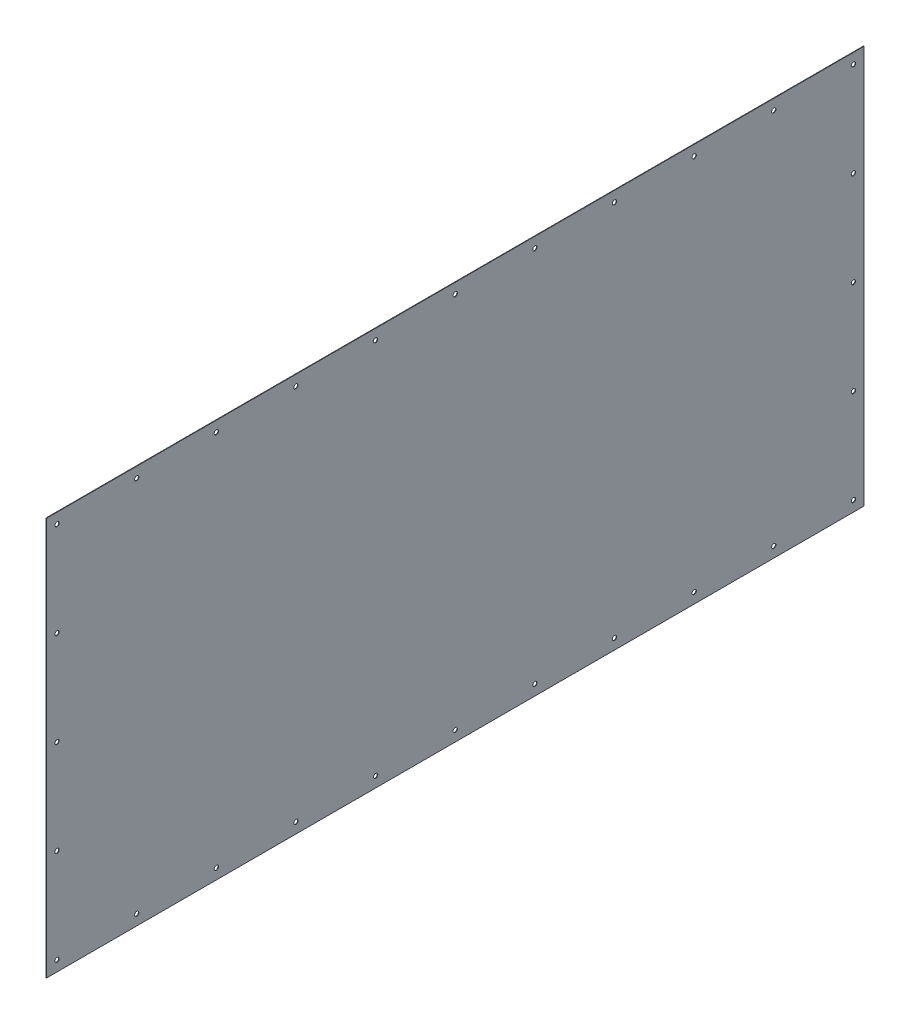
ISO-10303-21;
HEADER;
FILE_DESCRIPTION(('STEP AP214'),'2;1');
FILE_NAME('part.step','',(''),(''),'','','');
FILE_SCHEMA(('AUTOMOTIVE_DESIGN { 1 0 10303 214 1 1 1 1 }'));
ENDSEC;
DATA;
#1=APPLICATION_CONTEXT('core data for automotive mechanical design processes');
#2=APPLICATION_PROTOCOL_DEFINITION('international standard','automotive_design',2000,#1);
#3=PRODUCT_CONTEXT('',#1,'mechanical');
#4=PRODUCT('Part','Part','',(#3));
#5=PRODUCT_RELATED_PRODUCT_CATEGORY('part','',(#4));
#6=PRODUCT_DEFINITION_FORMATION('','',#4);
#7=PRODUCT_DEFINITION_CONTEXT('part definition',#1,'design');
#8=PRODUCT_DEFINITION('design','',#6,#7);
#9=PRODUCT_DEFINITION_SHAPE('','',#8);
#10=(LENGTH_UNIT() NAMED_UNIT(*) SI_UNIT(.MILLI.,.METRE.));
#11=(NAMED_UNIT(*) PLANE_ANGLE_UNIT() SI_UNIT($,.RADIAN.));
#12=(NAMED_UNIT(*) SI_UNIT($,.STERADIAN.) SOLID_ANGLE_UNIT());
#13=UNCERTAINTY_MEASURE_WITH_UNIT(LENGTH_MEASURE(1.E-05),#10,'distance_accuracy_value','');
#14=(GEOMETRIC_REPRESENTATION_CONTEXT(3) GLOBAL_UNCERTAINTY_ASSIGNED_CONTEXT((#13)) GLOBAL_UNIT_ASSIGNED_CONTEXT((#10,
#11,#12)) REPRESENTATION_CONTEXT('',''));
#15=CARTESIAN_POINT('',(0.,0.,0.));
#16=DIRECTION('',(0.,0.,1.));
#17=DIRECTION('',(1.,0.,0.));
#18=AXIS2_PLACEMENT_3D('',#15,#16,#17);
#19=CARTESIAN_POINT('',(1.,0.,0.));
#20=DIRECTION('',(1.,0.,0.));
#21=DIRECTION('',(0.,0.,-1.));
#22=AXIS2_PLACEMENT_3D('',#19,#20,#21);
#23=PLANE('',#22);
#24=CARTESIAN_POINT('',(1.,179.990000138896,-759.96));
#25=DIRECTION('',(1.,0.,0.));
#26=DIRECTION('',(0.,0.,-1.));
#27=AXIS2_PLACEMENT_3D('',#24,#25,#26);
#28=CIRCLE('',#27,4.10000000000004);
#29=CARTESIAN_POINT('',(1.,179.990000138896,-764.06));
#30=VERTEX_POINT('',#29);
#31=EDGE_CURVE('E265',#30,#30,#28,.T.);
#32=ORIENTED_EDGE('',*,*,#31,.F.);
#33=EDGE_LOOP('',(#32));
#34=FACE_BOUND('',#33,.T.);
#35=CARTESIAN_POINT('',(1.,-179.990000138897,759.96));
#36=DIRECTION('',(1.,0.,0.));
#37=DIRECTION('',(0.,0.,-1.));
#38=AXIS2_PLACEMENT_3D('',#35,#36,#37);
#39=CIRCLE('',#38,4.10000000000004);
#40=CARTESIAN_POINT('',(1.,-179.990000138897,755.86));
#41=VERTEX_POINT('',#40);
#42=EDGE_CURVE('E253',#41,#41,#39,.T.);
#43=ORIENTED_EDGE('',*,*,#42,.F.);
#44=EDGE_LOOP('',(#43));
#45=FACE_BOUND('',#44,.T.);
#46=CARTESIAN_POINT('',(1.,359.98,-759.94));
#47=DIRECTION('',(1.,0.,0.));
#48=DIRECTION('',(0.,0.,-1.));
#49=AXIS2_PLACEMENT_3D('',#46,#47,#48);
#50=CIRCLE('',#49,4.10000000000004);
#51=CARTESIAN_POINT('',(1.,359.98,-764.04));
#52=VERTEX_POINT('',#51);
#53=EDGE_CURVE('E241',#52,#52,#50,.T.);
#54=ORIENTED_EDGE('',*,*,#53,.F.);
#55=EDGE_LOOP('',(#54));
#56=FACE_BOUND('',#55,.T.);
#57=CARTESIAN_POINT('',(1.,359.98,-607.95));
#58=DIRECTION('',(1.,0.,0.));
#59=DIRECTION('',(0.,0.,-1.));
#60=AXIS2_PLACEMENT_3D('',#57,#58,#59);
#61=CIRCLE('',#60,4.10000000000004);
#62=CARTESIAN_POINT('',(1.,359.98,-612.05));
#63=VERTEX_POINT('',#62);
#64=EDGE_CURVE('E229',#63,#63,#61,.T.);
#65=ORIENTED_EDGE('',*,*,#64,.F.);
#66=EDGE_LOOP('',(#65));
#67=FACE_BOUND('',#66,.T.);
#68=CARTESIAN_POINT('',(1.,359.98,-455.96));
#69=DIRECTION('',(1.,0.,0.));
#70=DIRECTION('',(0.,0.,-1.));
#71=AXIS2_PLACEMENT_3D('',#68,#69,#70);
#72=CIRCLE('',#71,4.10000000000004);
#73=CARTESIAN_POINT('',(1.,359.98,-460.06));
#74=VERTEX_POINT('',#73);
#75=EDGE_CURVE('E217',#74,#74,#72,.T.);
#76=ORIENTED_EDGE('',*,*,#75,.F.);
#77=EDGE_LOOP('',(#76));
#78=FACE_BOUND('',#77,.T.);
#79=CARTESIAN_POINT('',(1.,359.98,-303.97));
#80=DIRECTION('',(1.,0.,0.));
#81=DIRECTION('',(0.,0.,-1.));
#82=AXIS2_PLACEMENT_3D('',#79,#80,#81);
#83=CIRCLE('',#82,4.10000000000004);
#84=CARTESIAN_POINT('',(1.,359.98,-308.07));
#85=VERTEX_POINT('',#84);
#86=EDGE_CURVE('E205',#85,#85,#83,.T.);
#87=ORIENTED_EDGE('',*,*,#86,.F.);
#88=EDGE_LOOP('',(#87));
#89=FACE_BOUND('',#88,.T.);
#90=CARTESIAN_POINT('',(1.,359.98,-151.98));
#91=DIRECTION('',(1.,0.,0.));
#92=DIRECTION('',(0.,0.,-1.));
#93=AXIS2_PLACEMENT_3D('',#90,#91,#92);
#94=CIRCLE('',#93,4.10000000000004);
#95=CARTESIAN_POINT('',(1.,359.98,-156.08));
#96=VERTEX_POINT('',#95);
#97=EDGE_CURVE('E193',#96,#96,#94,.T.);
#98=ORIENTED_EDGE('',*,*,#97,.F.);
#99=EDGE_LOOP('',(#98));
#100=FACE_BOUND('',#99,.T.);
#101=CARTESIAN_POINT('',(1.,359.98,0.00999999999973245));
#102=DIRECTION('',(1.,0.,0.));
#103=DIRECTION('',(0.,0.,-1.));
#104=AXIS2_PLACEMENT_3D('',#101,#102,#103);
#105=CIRCLE('',#104,4.10000000000004);
#106=CARTESIAN_POINT('',(1.,359.98,-4.09000000000031));
#107=VERTEX_POINT('',#106);
#108=EDGE_CURVE('E181',#107,#107,#105,.T.);
#109=ORIENTED_EDGE('',*,*,#108,.F.);
#110=EDGE_LOOP('',(#109));
#111=FACE_BOUND('',#110,.T.);
#112=CARTESIAN_POINT('',(1.,359.98,152.));
#113=DIRECTION('',(1.,0.,0.));
#114=DIRECTION('',(0.,0.,-1.));
#115=AXIS2_PLACEMENT_3D('',#112,#113,#114);
#116=CIRCLE('',#115,4.10000000000004);
#117=CARTESIAN_POINT('',(1.,359.98,147.9));
#118=VERTEX_POINT('',#117);
#119=EDGE_CURVE('E169',#118,#118,#116,.T.);
#120=ORIENTED_EDGE('',*,*,#119,.F.);
#121=EDGE_LOOP('',(#120));
#122=FACE_BOUND('',#121,.T.);
#123=CARTESIAN_POINT('',(1.,359.98,303.99));
#124=DIRECTION('',(1.,0.,0.));
#125=DIRECTION('',(0.,0.,-1.));
#126=AXIS2_PLACEMENT_3D('',#123,#124,#125);
#127=CIRCLE('',#126,4.10000000000004);
#128=CARTESIAN_POINT('',(1.,359.98,299.89));
#129=VERTEX_POINT('',#128);
#130=EDGE_CURVE('E157',#129,#129,#127,.T.);
#131=ORIENTED_EDGE('',*,*,#130,.F.);
#132=EDGE_LOOP('',(#131));
#133=FACE_BOUND('',#132,.T.);
#134=CARTESIAN_POINT('',(1.,359.98,455.98));
#135=DIRECTION('',(1.,0.,0.));
#136=DIRECTION('',(0.,0.,-1.));
#137=AXIS2_PLACEMENT_3D('',#134,#135,#136);
#138=CIRCLE('',#137,4.10000000000004);
#139=CARTESIAN_POINT('',(1.,359.98,451.88));
#140=VERTEX_POINT('',#139);
#141=EDGE_CURVE('E145',#140,#140,#138,.T.);
#142=ORIENTED_EDGE('',*,*,#141,.F.);
#143=EDGE_LOOP('',(#142));
#144=FACE_BOUND('',#143,.T.);
#145=CARTESIAN_POINT('',(1.,359.98,607.97));
#146=DIRECTION('',(1.,0.,0.));
#147=DIRECTION('',(0.,0.,-1.));
#148=AXIS2_PLACEMENT_3D('',#145,#146,#147);
#149=CIRCLE('',#148,4.10000000000004);
#150=CARTESIAN_POINT('',(1.,359.98,603.87));
#151=VERTEX_POINT('',#150);
#152=EDGE_CURVE('E133',#151,#151,#149,.T.);
#153=ORIENTED_EDGE('',*,*,#152,.F.);
#154=EDGE_LOOP('',(#153));
#155=FACE_BOUND('',#154,.T.);
#156=CARTESIAN_POINT('',(1.,179.990000138896,759.96));
#157=DIRECTION('',(1.,0.,0.));
#158=DIRECTION('',(0.,0.,-1.));
#159=AXIS2_PLACEMENT_3D('',#156,#157,#158);
#160=CIRCLE('',#159,4.10000000000004);
#161=CARTESIAN_POINT('',(1.,179.990000138896,755.86));
#162=VERTEX_POINT('',#161);
#163=EDGE_CURVE('E121',#162,#162,#160,.T.);
#164=ORIENTED_EDGE('',*,*,#163,.F.);
#165=EDGE_LOOP('',(#164));
#166=FACE_BOUND('',#165,.T.);
#167=CARTESIAN_POINT('',(1.,-359.98,759.96));
#168=DIRECTION('',(1.,0.,0.));
#169=DIRECTION('',(0.,0.,-1.));
#170=AXIS2_PLACEMENT_3D('',#167,#168,#169);
#171=CIRCLE('',#170,4.10000000000004);
#172=CARTESIAN_POINT('',(1.,-359.98,755.86));
#173=VERTEX_POINT('',#172);
#174=EDGE_CURVE('E100',#173,#173,#171,.T.);
#175=ORIENTED_EDGE('',*,*,#174,.F.);
#176=EDGE_LOOP('',(#175));
#177=FACE_BOUND('',#176,.T.);
#178=DIRECTION('',(0.,1.,0.));
#179=VECTOR('',#178,1.);
#180=CARTESIAN_POINT('',(1.,379.98,-779.96));
#181=LINE('',#180,#179);
#182=CARTESIAN_POINT('',(1.,-379.98,-779.96));
#183=VERTEX_POINT('',#182);
#184=CARTESIAN_POINT('',(1.,379.98,-779.96));
#185=VERTEX_POINT('',#184);
#186=EDGE_CURVE('E85',#183,#185,#181,.T.);
#187=ORIENTED_EDGE('',*,*,#186,.T.);
#188=DIRECTION('',(0.,0.,1.));
#189=VECTOR('',#188,1.);
#190=CARTESIAN_POINT('',(1.,379.98,779.96));
#191=LINE('',#190,#189);
#192=CARTESIAN_POINT('',(1.,379.98,779.96));
#193=VERTEX_POINT('',#192);
#194=EDGE_CURVE('E80',#185,#193,#191,.T.);
#195=ORIENTED_EDGE('',*,*,#194,.T.);
#196=DIRECTION('',(0.,-1.,0.));
#197=VECTOR('',#196,1.);
#198=CARTESIAN_POINT('',(1.,379.98,779.96));
#199=LINE('',#198,#197);
#200=CARTESIAN_POINT('',(1.,-379.98,779.96));
#201=VERTEX_POINT('',#200);
#202=EDGE_CURVE('E83',#193,#201,#199,.T.);
#203=ORIENTED_EDGE('',*,*,#202,.T.);
#204=DIRECTION('',(0.,0.,-1.));
#205=VECTOR('',#204,1.);
#206=CARTESIAN_POINT('',(1.,-379.98,779.96));
#207=LINE('',#206,#205);
#208=EDGE_CURVE('E50',#201,#183,#207,.T.);
#209=ORIENTED_EDGE('',*,*,#208,.T.);
#210=EDGE_LOOP('',(#187,#195,#203,#209));
#211=FACE_BOUND('',#210,.T.);
#212=CARTESIAN_POINT('',(1.,359.98,759.96));
#213=DIRECTION('',(1.,0.,0.));
#214=DIRECTION('',(0.,0.,-1.));
#215=AXIS2_PLACEMENT_3D('',#212,#213,#214);
#216=CIRCLE('',#215,4.10000000000004);
#217=CARTESIAN_POINT('',(1.,359.98,755.86));
#218=VERTEX_POINT('',#217);
#219=EDGE_CURVE('E115',#218,#218,#216,.T.);
#220=ORIENTED_EDGE('',*,*,#219,.F.);
#221=EDGE_LOOP('',(#220));
#222=FACE_BOUND('',#221,.T.);
#223=CARTESIAN_POINT('',(1.,-359.98,607.97));
#224=DIRECTION('',(1.,0.,0.));
#225=DIRECTION('',(0.,0.,-1.));
#226=AXIS2_PLACEMENT_3D('',#223,#224,#225);
#227=CIRCLE('',#226,4.10000000000004);
#228=CARTESIAN_POINT('',(1.,-359.98,603.87));
#229=VERTEX_POINT('',#228);
#230=EDGE_CURVE('E127',#229,#229,#227,.T.);
#231=ORIENTED_EDGE('',*,*,#230,.F.);
#232=EDGE_LOOP('',(#231));
#233=FACE_BOUND('',#232,.T.);
#234=CARTESIAN_POINT('',(1.,-359.98,455.98));
#235=DIRECTION('',(1.,0.,0.));
#236=DIRECTION('',(0.,0.,-1.));
#237=AXIS2_PLACEMENT_3D('',#234,#235,#236);
#238=CIRCLE('',#237,4.10000000000004);
#239=CARTESIAN_POINT('',(1.,-359.98,451.88));
#240=VERTEX_POINT('',#239);
#241=EDGE_CURVE('E139',#240,#240,#238,.T.);
#242=ORIENTED_EDGE('',*,*,#241,.F.);
#243=EDGE_LOOP('',(#242));
#244=FACE_BOUND('',#243,.T.);
#245=CARTESIAN_POINT('',(1.,-359.98,303.99));
#246=DIRECTION('',(1.,0.,0.));
#247=DIRECTION('',(0.,0.,-1.));
#248=AXIS2_PLACEMENT_3D('',#245,#246,#247);
#249=CIRCLE('',#248,4.10000000000004);
#250=CARTESIAN_POINT('',(1.,-359.98,299.89));
#251=VERTEX_POINT('',#250);
#252=EDGE_CURVE('E151',#251,#251,#249,.T.);
#253=ORIENTED_EDGE('',*,*,#252,.F.);
#254=EDGE_LOOP('',(#253));
#255=FACE_BOUND('',#254,.T.);
#256=CARTESIAN_POINT('',(1.,-359.98,152.));
#257=DIRECTION('',(1.,0.,0.));
#258=DIRECTION('',(0.,0.,-1.));
#259=AXIS2_PLACEMENT_3D('',#256,#257,#258);
#260=CIRCLE('',#259,4.10000000000004);
#261=CARTESIAN_POINT('',(1.,-359.98,147.9));
#262=VERTEX_POINT('',#261);
#263=EDGE_CURVE('E163',#262,#262,#260,.T.);
#264=ORIENTED_EDGE('',*,*,#263,.F.);
#265=EDGE_LOOP('',(#264));
#266=FACE_BOUND('',#265,.T.);
#267=CARTESIAN_POINT('',(1.,-359.98,0.00999999999973245));
#268=DIRECTION('',(1.,0.,0.));
#269=DIRECTION('',(0.,0.,-1.));
#270=AXIS2_PLACEMENT_3D('',#267,#268,#269);
#271=CIRCLE('',#270,4.10000000000004);
#272=CARTESIAN_POINT('',(1.,-359.98,-4.09000000000031));
#273=VERTEX_POINT('',#272);
#274=EDGE_CURVE('E175',#273,#273,#271,.T.);
#275=ORIENTED_EDGE('',*,*,#274,.F.);
#276=EDGE_LOOP('',(#275));
#277=FACE_BOUND('',#276,.T.);
#278=CARTESIAN_POINT('',(1.,-359.98,-151.98));
#279=DIRECTION('',(1.,0.,0.));
#280=DIRECTION('',(0.,0.,-1.));
#281=AXIS2_PLACEMENT_3D('',#278,#279,#280);
#282=CIRCLE('',#281,4.10000000000004);
#283=CARTESIAN_POINT('',(1.,-359.98,-156.08));
#284=VERTEX_POINT('',#283);
#285=EDGE_CURVE('E187',#284,#284,#282,.T.);
#286=ORIENTED_EDGE('',*,*,#285,.F.);
#287=EDGE_LOOP('',(#286));
#288=FACE_BOUND('',#287,.T.);
#289=CARTESIAN_POINT('',(1.,-359.98,-303.97));
#290=DIRECTION('',(1.,0.,0.));
#291=DIRECTION('',(0.,0.,-1.));
#292=AXIS2_PLACEMENT_3D('',#289,#290,#291);
#293=CIRCLE('',#292,4.10000000000004);
#294=CARTESIAN_POINT('',(1.,-359.98,-308.07));
#295=VERTEX_POINT('',#294);
#296=EDGE_CURVE('E199',#295,#295,#293,.T.);
#297=ORIENTED_EDGE('',*,*,#296,.F.);
#298=EDGE_LOOP('',(#297));
#299=FACE_BOUND('',#298,.T.);
#300=CARTESIAN_POINT('',(1.,-359.98,-455.96));
#301=DIRECTION('',(1.,0.,0.));
#302=DIRECTION('',(0.,0.,-1.));
#303=AXIS2_PLACEMENT_3D('',#300,#301,#302);
#304=CIRCLE('',#303,4.10000000000004);
#305=CARTESIAN_POINT('',(1.,-359.98,-460.06));
#306=VERTEX_POINT('',#305);
#307=EDGE_CURVE('E211',#306,#306,#304,.T.);
#308=ORIENTED_EDGE('',*,*,#307,.F.);
#309=EDGE_LOOP('',(#308));
#310=FACE_BOUND('',#309,.T.);
#311=CARTESIAN_POINT('',(1.,-359.98,-607.95));
#312=DIRECTION('',(1.,0.,0.));
#313=DIRECTION('',(0.,0.,-1.));
#314=AXIS2_PLACEMENT_3D('',#311,#312,#313);
#315=CIRCLE('',#314,4.10000000000004);
#316=CARTESIAN_POINT('',(1.,-359.98,-612.05));
#317=VERTEX_POINT('',#316);
#318=EDGE_CURVE('E223',#317,#317,#315,.T.);
#319=ORIENTED_EDGE('',*,*,#318,.F.);
#320=EDGE_LOOP('',(#319));
#321=FACE_BOUND('',#320,.T.);
#322=CARTESIAN_POINT('',(1.,-359.98,-759.94));
#323=DIRECTION('',(1.,0.,0.));
#324=DIRECTION('',(0.,0.,-1.));
#325=AXIS2_PLACEMENT_3D('',#322,#323,#324);
#326=CIRCLE('',#325,4.10000000000004);
#327=CARTESIAN_POINT('',(1.,-359.98,-764.04));
#328=VERTEX_POINT('',#327);
#329=EDGE_CURVE('E235',#328,#328,#326,.T.);
#330=ORIENTED_EDGE('',*,*,#329,.F.);
#331=EDGE_LOOP('',(#330));
#332=FACE_BOUND('',#331,.T.);
#333=CARTESIAN_POINT('',(1.,1.11022302462516E-13,759.96));
#334=DIRECTION('',(1.,0.,0.));
#335=DIRECTION('',(0.,0.,-1.));
#336=AXIS2_PLACEMENT_3D('',#333,#334,#335);
#337=CIRCLE('',#336,4.10000000000004);
#338=CARTESIAN_POINT('',(1.,1.11022302462516E-13,755.86));
#339=VERTEX_POINT('',#338);
#340=EDGE_CURVE('E247',#339,#339,#337,.T.);
#341=ORIENTED_EDGE('',*,*,#340,.F.);
#342=EDGE_LOOP('',(#341));
#343=FACE_BOUND('',#342,.T.);
#344=CARTESIAN_POINT('',(1.,1.11022302462516E-13,-759.96));
#345=DIRECTION('',(1.,0.,0.));
#346=DIRECTION('',(0.,0.,-1.));
#347=AXIS2_PLACEMENT_3D('',#344,#345,#346);
#348=CIRCLE('',#347,4.10000000000004);
#349=CARTESIAN_POINT('',(1.,1.11022302462516E-13,-764.06));
#350=VERTEX_POINT('',#349);
#351=EDGE_CURVE('E259',#350,#350,#348,.T.);
#352=ORIENTED_EDGE('',*,*,#351,.F.);
#353=EDGE_LOOP('',(#352));
#354=FACE_BOUND('',#353,.T.);
#355=CARTESIAN_POINT('',(1.,-179.990000138897,-759.96));
#356=DIRECTION('',(1.,0.,0.));
#357=DIRECTION('',(0.,0.,-1.));
#358=AXIS2_PLACEMENT_3D('',#355,#356,#357);
#359=CIRCLE('',#358,4.10000000000004);
#360=CARTESIAN_POINT('',(1.,-179.990000138897,-764.06));
#361=VERTEX_POINT('',#360);
#362=EDGE_CURVE('E271',#361,#361,#359,.T.);
#363=ORIENTED_EDGE('',*,*,#362,.F.);
#364=EDGE_LOOP('',(#363));
#365=FACE_BOUND('',#364,.T.);
#366=ADVANCED_FACE('F33',(#34,#45,#56,#67,#78,#89,#100,#111,#122,#133,#144,#155,#166,#177,#211,
#222,#233,#244,#255,#266,#277,#288,#299,#310,#321,#332,#343,#354,#365),#23,.T.);
#367=CARTESIAN_POINT('',(0.,0.,0.));
#368=DIRECTION('',(1.,0.,0.));
#369=DIRECTION('',(0.,0.,-1.));
#370=AXIS2_PLACEMENT_3D('',#367,#368,#369);
#371=PLANE('',#370);
#372=DIRECTION('',(0.,1.,0.));
#373=VECTOR('',#372,1.);
#374=CARTESIAN_POINT('',(0.,379.98,-779.96));
#375=LINE('',#374,#373);
#376=CARTESIAN_POINT('',(0.,-379.98,-779.96));
#377=VERTEX_POINT('',#376);
#378=CARTESIAN_POINT('',(0.,379.98,-779.96));
#379=VERTEX_POINT('',#378);
#380=EDGE_CURVE('E97',#377,#379,#375,.T.);
#381=ORIENTED_EDGE('',*,*,#380,.F.);
#382=DIRECTION('',(0.,0.,-1.));
#383=VECTOR('',#382,1.);
#384=CARTESIAN_POINT('',(0.,-379.98,779.96));
#385=LINE('',#384,#383);
#386=CARTESIAN_POINT('',(0.,-379.98,779.96));
#387=VERTEX_POINT('',#386);
#388=EDGE_CURVE('E73',#387,#377,#385,.T.);
#389=ORIENTED_EDGE('',*,*,#388,.F.);
#390=DIRECTION('',(0.,-1.,0.));
#391=VECTOR('',#390,1.);
#392=CARTESIAN_POINT('',(0.,379.98,779.96));
#393=LINE('',#392,#391);
#394=CARTESIAN_POINT('',(0.,379.98,779.96));
#395=VERTEX_POINT('',#394);
#396=EDGE_CURVE('E67',#395,#387,#393,.T.);
#397=ORIENTED_EDGE('',*,*,#396,.F.);
#398=DIRECTION('',(0.,0.,1.));
#399=VECTOR('',#398,1.);
#400=CARTESIAN_POINT('',(0.,379.98,779.96));
#401=LINE('',#400,#399);
#402=EDGE_CURVE('E89',#379,#395,#401,.T.);
#403=ORIENTED_EDGE('',*,*,#402,.F.);
#404=EDGE_LOOP('',(#381,#389,#397,#403));
#405=FACE_BOUND('',#404,.T.);
#406=CARTESIAN_POINT('',(0.,-359.98,759.96));
#407=DIRECTION('',(1.,0.,0.));
#408=DIRECTION('',(0.,0.,-1.));
#409=AXIS2_PLACEMENT_3D('',#406,#407,#408);
#410=CIRCLE('',#409,4.10000000000004);
#411=CARTESIAN_POINT('',(0.,-359.98,755.86));
#412=VERTEX_POINT('',#411);
#413=EDGE_CURVE('E112',#412,#412,#410,.T.);
#414=ORIENTED_EDGE('',*,*,#413,.T.);
#415=EDGE_LOOP('',(#414));
#416=FACE_BOUND('',#415,.T.);
#417=CARTESIAN_POINT('',(0.,359.98,759.96));
#418=DIRECTION('',(1.,0.,0.));
#419=DIRECTION('',(0.,0.,-1.));
#420=AXIS2_PLACEMENT_3D('',#417,#418,#419);
#421=CIRCLE('',#420,4.10000000000004);
#422=CARTESIAN_POINT('',(0.,359.98,755.86));
#423=VERTEX_POINT('',#422);
#424=EDGE_CURVE('E118',#423,#423,#421,.T.);
#425=ORIENTED_EDGE('',*,*,#424,.T.);
#426=EDGE_LOOP('',(#425));
#427=FACE_BOUND('',#426,.T.);
#428=CARTESIAN_POINT('',(0.,179.990000138896,759.96));
#429=DIRECTION('',(1.,0.,0.));
#430=DIRECTION('',(0.,0.,-1.));
#431=AXIS2_PLACEMENT_3D('',#428,#429,#430);
#432=CIRCLE('',#431,4.10000000000004);
#433=CARTESIAN_POINT('',(0.,179.990000138896,755.86));
#434=VERTEX_POINT('',#433);
#435=EDGE_CURVE('E124',#434,#434,#432,.T.);
#436=ORIENTED_EDGE('',*,*,#435,.T.);
#437=EDGE_LOOP('',(#436));
#438=FACE_BOUND('',#437,.T.);
#439=CARTESIAN_POINT('',(0.,-359.98,607.97));
#440=DIRECTION('',(1.,0.,0.));
#441=DIRECTION('',(0.,0.,-1.));
#442=AXIS2_PLACEMENT_3D('',#439,#440,#441);
#443=CIRCLE('',#442,4.10000000000004);
#444=CARTESIAN_POINT('',(0.,-359.98,603.87));
#445=VERTEX_POINT('',#444);
#446=EDGE_CURVE('E130',#445,#445,#443,.T.);
#447=ORIENTED_EDGE('',*,*,#446,.T.);
#448=EDGE_LOOP('',(#447));
#449=FACE_BOUND('',#448,.T.);
#450=CARTESIAN_POINT('',(0.,359.98,607.97));
#451=DIRECTION('',(1.,0.,0.));
#452=DIRECTION('',(0.,0.,-1.));
#453=AXIS2_PLACEMENT_3D('',#450,#451,#452);
#454=CIRCLE('',#453,4.10000000000004);
#455=CARTESIAN_POINT('',(0.,359.98,603.87));
#456=VERTEX_POINT('',#455);
#457=EDGE_CURVE('E136',#456,#456,#454,.T.);
#458=ORIENTED_EDGE('',*,*,#457,.T.);
#459=EDGE_LOOP('',(#458));
#460=FACE_BOUND('',#459,.T.);
#461=CARTESIAN_POINT('',(0.,-359.98,455.98));
#462=DIRECTION('',(1.,0.,0.));
#463=DIRECTION('',(0.,0.,-1.));
#464=AXIS2_PLACEMENT_3D('',#461,#462,#463);
#465=CIRCLE('',#464,4.10000000000004);
#466=CARTESIAN_POINT('',(0.,-359.98,451.88));
#467=VERTEX_POINT('',#466);
#468=EDGE_CURVE('E142',#467,#467,#465,.T.);
#469=ORIENTED_EDGE('',*,*,#468,.T.);
#470=EDGE_LOOP('',(#469));
#471=FACE_BOUND('',#470,.T.);
#472=CARTESIAN_POINT('',(0.,359.98,455.98));
#473=DIRECTION('',(1.,0.,0.));
#474=DIRECTION('',(0.,0.,-1.));
#475=AXIS2_PLACEMENT_3D('',#472,#473,#474);
#476=CIRCLE('',#475,4.10000000000004);
#477=CARTESIAN_POINT('',(0.,359.98,451.88));
#478=VERTEX_POINT('',#477);
#479=EDGE_CURVE('E148',#478,#478,#476,.T.);
#480=ORIENTED_EDGE('',*,*,#479,.T.);
#481=EDGE_LOOP('',(#480));
#482=FACE_BOUND('',#481,.T.);
#483=CARTESIAN_POINT('',(0.,-359.98,303.99));
#484=DIRECTION('',(1.,0.,0.));
#485=DIRECTION('',(0.,0.,-1.));
#486=AXIS2_PLACEMENT_3D('',#483,#484,#485);
#487=CIRCLE('',#486,4.10000000000004);
#488=CARTESIAN_POINT('',(0.,-359.98,299.89));
#489=VERTEX_POINT('',#488);
#490=EDGE_CURVE('E154',#489,#489,#487,.T.);
#491=ORIENTED_EDGE('',*,*,#490,.T.);
#492=EDGE_LOOP('',(#491));
#493=FACE_BOUND('',#492,.T.);
#494=CARTESIAN_POINT('',(0.,359.98,303.99));
#495=DIRECTION('',(1.,0.,0.));
#496=DIRECTION('',(0.,0.,-1.));
#497=AXIS2_PLACEMENT_3D('',#494,#495,#496);
#498=CIRCLE('',#497,4.10000000000004);
#499=CARTESIAN_POINT('',(0.,359.98,299.89));
#500=VERTEX_POINT('',#499);
#501=EDGE_CURVE('E160',#500,#500,#498,.T.);
#502=ORIENTED_EDGE('',*,*,#501,.T.);
#503=EDGE_LOOP('',(#502));
#504=FACE_BOUND('',#503,.T.);
#505=CARTESIAN_POINT('',(0.,-359.98,152.));
#506=DIRECTION('',(1.,0.,0.));
#507=DIRECTION('',(0.,0.,-1.));
#508=AXIS2_PLACEMENT_3D('',#505,#506,#507);
#509=CIRCLE('',#508,4.10000000000004);
#510=CARTESIAN_POINT('',(0.,-359.98,147.9));
#511=VERTEX_POINT('',#510);
#512=EDGE_CURVE('E166',#511,#511,#509,.T.);
#513=ORIENTED_EDGE('',*,*,#512,.T.);
#514=EDGE_LOOP('',(#513));
#515=FACE_BOUND('',#514,.T.);
#516=CARTESIAN_POINT('',(0.,359.98,152.));
#517=DIRECTION('',(1.,0.,0.));
#518=DIRECTION('',(0.,0.,-1.));
#519=AXIS2_PLACEMENT_3D('',#516,#517,#518);
#520=CIRCLE('',#519,4.10000000000004);
#521=CARTESIAN_POINT('',(0.,359.98,147.9));
#522=VERTEX_POINT('',#521);
#523=EDGE_CURVE('E172',#522,#522,#520,.T.);
#524=ORIENTED_EDGE('',*,*,#523,.T.);
#525=EDGE_LOOP('',(#524));
#526=FACE_BOUND('',#525,.T.);
#527=CARTESIAN_POINT('',(0.,-359.98,0.00999999999973245));
#528=DIRECTION('',(1.,0.,0.));
#529=DIRECTION('',(0.,0.,-1.));
#530=AXIS2_PLACEMENT_3D('',#527,#528,#529);
#531=CIRCLE('',#530,4.10000000000004);
#532=CARTESIAN_POINT('',(0.,-359.98,-4.09000000000031));
#533=VERTEX_POINT('',#532);
#534=EDGE_CURVE('E178',#533,#533,#531,.T.);
#535=ORIENTED_EDGE('',*,*,#534,.T.);
#536=EDGE_LOOP('',(#535));
#537=FACE_BOUND('',#536,.T.);
#538=CARTESIAN_POINT('',(0.,359.98,0.00999999999973245));
#539=DIRECTION('',(1.,0.,0.));
#540=DIRECTION('',(0.,0.,-1.));
#541=AXIS2_PLACEMENT_3D('',#538,#539,#540);
#542=CIRCLE('',#541,4.10000000000004);
#543=CARTESIAN_POINT('',(0.,359.98,-4.09000000000031));
#544=VERTEX_POINT('',#543);
#545=EDGE_CURVE('E184',#544,#544,#542,.T.);
#546=ORIENTED_EDGE('',*,*,#545,.T.);
#547=EDGE_LOOP('',(#546));
#548=FACE_BOUND('',#547,.T.);
#549=CARTESIAN_POINT('',(0.,-359.98,-151.98));
#550=DIRECTION('',(1.,0.,0.));
#551=DIRECTION('',(0.,0.,-1.));
#552=AXIS2_PLACEMENT_3D('',#549,#550,#551);
#553=CIRCLE('',#552,4.10000000000004);
#554=CARTESIAN_POINT('',(0.,-359.98,-156.08));
#555=VERTEX_POINT('',#554);
#556=EDGE_CURVE('E190',#555,#555,#553,.T.);
#557=ORIENTED_EDGE('',*,*,#556,.T.);
#558=EDGE_LOOP('',(#557));
#559=FACE_BOUND('',#558,.T.);
#560=CARTESIAN_POINT('',(0.,359.98,-151.98));
#561=DIRECTION('',(1.,0.,0.));
#562=DIRECTION('',(0.,0.,-1.));
#563=AXIS2_PLACEMENT_3D('',#560,#561,#562);
#564=CIRCLE('',#563,4.10000000000004);
#565=CARTESIAN_POINT('',(0.,359.98,-156.08));
#566=VERTEX_POINT('',#565);
#567=EDGE_CURVE('E196',#566,#566,#564,.T.);
#568=ORIENTED_EDGE('',*,*,#567,.T.);
#569=EDGE_LOOP('',(#568));
#570=FACE_BOUND('',#569,.T.);
#571=CARTESIAN_POINT('',(0.,-359.98,-303.97));
#572=DIRECTION('',(1.,0.,0.));
#573=DIRECTION('',(0.,0.,-1.));
#574=AXIS2_PLACEMENT_3D('',#571,#572,#573);
#575=CIRCLE('',#574,4.10000000000004);
#576=CARTESIAN_POINT('',(0.,-359.98,-308.07));
#577=VERTEX_POINT('',#576);
#578=EDGE_CURVE('E202',#577,#577,#575,.T.);
#579=ORIENTED_EDGE('',*,*,#578,.T.);
#580=EDGE_LOOP('',(#579));
#581=FACE_BOUND('',#580,.T.);
#582=CARTESIAN_POINT('',(0.,359.98,-303.97));
#583=DIRECTION('',(1.,0.,0.));
#584=DIRECTION('',(0.,0.,-1.));
#585=AXIS2_PLACEMENT_3D('',#582,#583,#584);
#586=CIRCLE('',#585,4.10000000000004);
#587=CARTESIAN_POINT('',(0.,359.98,-308.07));
#588=VERTEX_POINT('',#587);
#589=EDGE_CURVE('E208',#588,#588,#586,.T.);
#590=ORIENTED_EDGE('',*,*,#589,.T.);
#591=EDGE_LOOP('',(#590));
#592=FACE_BOUND('',#591,.T.);
#593=CARTESIAN_POINT('',(0.,-359.98,-455.96));
#594=DIRECTION('',(1.,0.,0.));
#595=DIRECTION('',(0.,0.,-1.));
#596=AXIS2_PLACEMENT_3D('',#593,#594,#595);
#597=CIRCLE('',#596,4.10000000000004);
#598=CARTESIAN_POINT('',(0.,-359.98,-460.06));
#599=VERTEX_POINT('',#598);
#600=EDGE_CURVE('E214',#599,#599,#597,.T.);
#601=ORIENTED_EDGE('',*,*,#600,.T.);
#602=EDGE_LOOP('',(#601));
#603=FACE_BOUND('',#602,.T.);
#604=CARTESIAN_POINT('',(0.,359.98,-455.96));
#605=DIRECTION('',(1.,0.,0.));
#606=DIRECTION('',(0.,0.,-1.));
#607=AXIS2_PLACEMENT_3D('',#604,#605,#606);
#608=CIRCLE('',#607,4.10000000000004);
#609=CARTESIAN_POINT('',(0.,359.98,-460.06));
#610=VERTEX_POINT('',#609);
#611=EDGE_CURVE('E220',#610,#610,#608,.T.);
#612=ORIENTED_EDGE('',*,*,#611,.T.);
#613=EDGE_LOOP('',(#612));
#614=FACE_BOUND('',#613,.T.);
#615=CARTESIAN_POINT('',(0.,-359.98,-607.95));
#616=DIRECTION('',(1.,0.,0.));
#617=DIRECTION('',(0.,0.,-1.));
#618=AXIS2_PLACEMENT_3D('',#615,#616,#617);
#619=CIRCLE('',#618,4.10000000000004);
#620=CARTESIAN_POINT('',(0.,-359.98,-612.05));
#621=VERTEX_POINT('',#620);
#622=EDGE_CURVE('E226',#621,#621,#619,.T.);
#623=ORIENTED_EDGE('',*,*,#622,.T.);
#624=EDGE_LOOP('',(#623));
#625=FACE_BOUND('',#624,.T.);
#626=CARTESIAN_POINT('',(0.,359.98,-607.95));
#627=DIRECTION('',(1.,0.,0.));
#628=DIRECTION('',(0.,0.,-1.));
#629=AXIS2_PLACEMENT_3D('',#626,#627,#628);
#630=CIRCLE('',#629,4.10000000000004);
#631=CARTESIAN_POINT('',(0.,359.98,-612.05));
#632=VERTEX_POINT('',#631);
#633=EDGE_CURVE('E232',#632,#632,#630,.T.);
#634=ORIENTED_EDGE('',*,*,#633,.T.);
#635=EDGE_LOOP('',(#634));
#636=FACE_BOUND('',#635,.T.);
#637=CARTESIAN_POINT('',(0.,-359.98,-759.94));
#638=DIRECTION('',(1.,0.,0.));
#639=DIRECTION('',(0.,0.,-1.));
#640=AXIS2_PLACEMENT_3D('',#637,#638,#639);
#641=CIRCLE('',#640,4.10000000000004);
#642=CARTESIAN_POINT('',(0.,-359.98,-764.04));
#643=VERTEX_POINT('',#642);
#644=EDGE_CURVE('E238',#643,#643,#641,.T.);
#645=ORIENTED_EDGE('',*,*,#644,.T.);
#646=EDGE_LOOP('',(#645));
#647=FACE_BOUND('',#646,.T.);
#648=CARTESIAN_POINT('',(0.,359.98,-759.94));
#649=DIRECTION('',(1.,0.,0.));
#650=DIRECTION('',(0.,0.,-1.));
#651=AXIS2_PLACEMENT_3D('',#648,#649,#650);
#652=CIRCLE('',#651,4.10000000000004);
#653=CARTESIAN_POINT('',(0.,359.98,-764.04));
#654=VERTEX_POINT('',#653);
#655=EDGE_CURVE('E244',#654,#654,#652,.T.);
#656=ORIENTED_EDGE('',*,*,#655,.T.);
#657=EDGE_LOOP('',(#656));
#658=FACE_BOUND('',#657,.T.);
#659=CARTESIAN_POINT('',(0.,1.11022302462516E-13,759.96));
#660=DIRECTION('',(1.,0.,0.));
#661=DIRECTION('',(0.,0.,-1.));
#662=AXIS2_PLACEMENT_3D('',#659,#660,#661);
#663=CIRCLE('',#662,4.10000000000004);
#664=CARTESIAN_POINT('',(0.,1.11022302462516E-13,755.86));
#665=VERTEX_POINT('',#664);
#666=EDGE_CURVE('E250',#665,#665,#663,.T.);
#667=ORIENTED_EDGE('',*,*,#666,.T.);
#668=EDGE_LOOP('',(#667));
#669=FACE_BOUND('',#668,.T.);
#670=CARTESIAN_POINT('',(0.,-179.990000138897,759.96));
#671=DIRECTION('',(1.,0.,0.));
#672=DIRECTION('',(0.,0.,-1.));
#673=AXIS2_PLACEMENT_3D('',#670,#671,#672);
#674=CIRCLE('',#673,4.10000000000004);
#675=CARTESIAN_POINT('',(0.,-179.990000138897,755.86));
#676=VERTEX_POINT('',#675);
#677=EDGE_CURVE('E256',#676,#676,#674,.T.);
#678=ORIENTED_EDGE('',*,*,#677,.T.);
#679=EDGE_LOOP('',(#678));
#680=FACE_BOUND('',#679,.T.);
#681=CARTESIAN_POINT('',(0.,1.11022302462516E-13,-759.96));
#682=DIRECTION('',(1.,0.,0.));
#683=DIRECTION('',(0.,0.,-1.));
#684=AXIS2_PLACEMENT_3D('',#681,#682,#683);
#685=CIRCLE('',#684,4.10000000000004);
#686=CARTESIAN_POINT('',(0.,1.11022302462516E-13,-764.06));
#687=VERTEX_POINT('',#686);
#688=EDGE_CURVE('E262',#687,#687,#685,.T.);
#689=ORIENTED_EDGE('',*,*,#688,.T.);
#690=EDGE_LOOP('',(#689));
#691=FACE_BOUND('',#690,.T.);
#692=CARTESIAN_POINT('',(0.,179.990000138896,-759.96));
#693=DIRECTION('',(1.,0.,0.));
#694=DIRECTION('',(0.,0.,-1.));
#695=AXIS2_PLACEMENT_3D('',#692,#693,#694);
#696=CIRCLE('',#695,4.10000000000004);
#697=CARTESIAN_POINT('',(0.,179.990000138896,-764.06));
#698=VERTEX_POINT('',#697);
#699=EDGE_CURVE('E268',#698,#698,#696,.T.);
#700=ORIENTED_EDGE('',*,*,#699,.T.);
#701=EDGE_LOOP('',(#700));
#702=FACE_BOUND('',#701,.T.);
#703=CARTESIAN_POINT('',(0.,-179.990000138897,-759.96));
#704=DIRECTION('',(1.,0.,0.));
#705=DIRECTION('',(0.,0.,-1.));
#706=AXIS2_PLACEMENT_3D('',#703,#704,#705);
#707=CIRCLE('',#706,4.10000000000004);
#708=CARTESIAN_POINT('',(0.,-179.990000138897,-764.06));
#709=VERTEX_POINT('',#708);
#710=EDGE_CURVE('E274',#709,#709,#707,.T.);
#711=ORIENTED_EDGE('',*,*,#710,.T.);
#712=EDGE_LOOP('',(#711));
#713=FACE_BOUND('',#712,.T.);
#714=ADVANCED_FACE('F108',(#405,#416,#427,#438,#449,#460,#471,#482,#493,#504,#515,#526,#537,
#548,#559,#570,#581,#592,#603,#614,#625,#636,#647,#658,#669,#680,#691,#702,#713),#371,.F.);
#715=CARTESIAN_POINT('',(1.,379.98,-779.96));
#716=DIRECTION('',(0.,0.,1.));
#717=DIRECTION('',(0.,-1.,0.));
#718=AXIS2_PLACEMENT_3D('',#715,#716,#717);
#719=PLANE('',#718);
#720=ORIENTED_EDGE('',*,*,#380,.T.);
#721=DIRECTION('',(-1.,0.,0.));
#722=VECTOR('',#721,1.);
#723=CARTESIAN_POINT('',(1.,379.98,-779.96));
#724=LINE('',#723,#722);
#725=EDGE_CURVE('E11',#185,#379,#724,.T.);
#726=ORIENTED_EDGE('',*,*,#725,.F.);
#727=ORIENTED_EDGE('',*,*,#186,.F.);
#728=DIRECTION('',(-1.,0.,0.));
#729=VECTOR('',#728,1.);
#730=CARTESIAN_POINT('',(1.,-379.98,-779.96));
#731=LINE('',#730,#729);
#732=EDGE_CURVE('E93',#183,#377,#731,.T.);
#733=ORIENTED_EDGE('',*,*,#732,.T.);
#734=EDGE_LOOP('',(#720,#726,#727,#733));
#735=FACE_BOUND('',#734,.T.);
#736=ADVANCED_FACE('F35',(#735),#719,.F.);
#737=CARTESIAN_POINT('',(1.,379.98,779.96));
#738=DIRECTION('',(0.,-1.,0.));
#739=DIRECTION('',(0.,0.,-1.));
#740=AXIS2_PLACEMENT_3D('',#737,#738,#739);
#741=PLANE('',#740);
#742=ORIENTED_EDGE('',*,*,#402,.T.);
#743=DIRECTION('',(-1.,0.,0.));
#744=VECTOR('',#743,1.);
#745=CARTESIAN_POINT('',(1.,379.98,779.96));
#746=LINE('',#745,#744);
#747=EDGE_CURVE('E42',#193,#395,#746,.T.);
#748=ORIENTED_EDGE('',*,*,#747,.F.);
#749=ORIENTED_EDGE('',*,*,#194,.F.);
#750=ORIENTED_EDGE('',*,*,#725,.T.);
#751=EDGE_LOOP('',(#742,#748,#749,#750));
#752=FACE_BOUND('',#751,.T.);
#753=ADVANCED_FACE('F88',(#752),#741,.F.);
#754=CARTESIAN_POINT('',(1.,379.98,779.96));
#755=DIRECTION('',(0.,0.,-1.));
#756=DIRECTION('',(-1.,0.,0.));
#757=AXIS2_PLACEMENT_3D('',#754,#755,#756);
#758=PLANE('',#757);
#759=ORIENTED_EDGE('',*,*,#396,.T.);
#760=DIRECTION('',(-1.,0.,0.));
#761=VECTOR('',#760,1.);
#762=CARTESIAN_POINT('',(1.,-379.98,779.96));
#763=LINE('',#762,#761);
#764=EDGE_CURVE('E90',#201,#387,#763,.T.);
#765=ORIENTED_EDGE('',*,*,#764,.F.);
#766=ORIENTED_EDGE('',*,*,#202,.F.);
#767=ORIENTED_EDGE('',*,*,#747,.T.);
#768=EDGE_LOOP('',(#759,#765,#766,#767));
#769=FACE_BOUND('',#768,.T.);
#770=ADVANCED_FACE('F91',(#769),#758,.F.);
#771=CARTESIAN_POINT('',(1.,-379.98,779.96));
#772=DIRECTION('',(0.,1.,0.));
#773=DIRECTION('',(0.,0.,1.));
#774=AXIS2_PLACEMENT_3D('',#771,#772,#773);
#775=PLANE('',#774);
#776=ORIENTED_EDGE('',*,*,#388,.T.);
#777=ORIENTED_EDGE('',*,*,#732,.F.);
#778=ORIENTED_EDGE('',*,*,#208,.F.);
#779=ORIENTED_EDGE('',*,*,#764,.T.);
#780=EDGE_LOOP('',(#776,#777,#778,#779));
#781=FACE_BOUND('',#780,.T.);
#782=ADVANCED_FACE('F105',(#781),#775,.F.);
#783=CARTESIAN_POINT('',(1.,-359.98,759.96));
#784=DIRECTION('',(-1.,0.,0.));
#785=DIRECTION('',(0.,0.,1.));
#786=AXIS2_PLACEMENT_3D('',#783,#784,#785);
#787=CYLINDRICAL_SURFACE('',#786,4.10000000000004);
#788=ORIENTED_EDGE('',*,*,#174,.T.);
#789=EDGE_LOOP('',(#788));
#790=FACE_BOUND('',#789,.T.);
#791=ORIENTED_EDGE('',*,*,#413,.F.);
#792=EDGE_LOOP('',(#791));
#793=FACE_BOUND('',#792,.T.);
#794=ADVANCED_FACE('F293',(#790,#793),#787,.F.);
#795=CARTESIAN_POINT('',(1.,359.98,759.96));
#796=DIRECTION('',(-1.,0.,0.));
#797=DIRECTION('',(0.,0.,1.));
#798=AXIS2_PLACEMENT_3D('',#795,#796,#797);
#799=CYLINDRICAL_SURFACE('',#798,4.10000000000004);
#800=ORIENTED_EDGE('',*,*,#219,.T.);
#801=EDGE_LOOP('',(#800));
#802=FACE_BOUND('',#801,.T.);
#803=ORIENTED_EDGE('',*,*,#424,.F.);
#804=EDGE_LOOP('',(#803));
#805=FACE_BOUND('',#804,.T.);
#806=ADVANCED_FACE('F339',(#802,#805),#799,.F.);
#807=CARTESIAN_POINT('',(1.,179.990000138896,759.96));
#808=DIRECTION('',(-1.,0.,0.));
#809=DIRECTION('',(0.,0.,1.));
#810=AXIS2_PLACEMENT_3D('',#807,#808,#809);
#811=CYLINDRICAL_SURFACE('',#810,4.10000000000004);
#812=ORIENTED_EDGE('',*,*,#163,.T.);
#813=EDGE_LOOP('',(#812));
#814=FACE_BOUND('',#813,.T.);
#815=ORIENTED_EDGE('',*,*,#435,.F.);
#816=EDGE_LOOP('',(#815));
#817=FACE_BOUND('',#816,.T.);
#818=ADVANCED_FACE('F347',(#814,#817),#811,.F.);
#819=CARTESIAN_POINT('',(1.,-359.98,607.97));
#820=DIRECTION('',(-1.,0.,0.));
#821=DIRECTION('',(0.,0.,1.));
#822=AXIS2_PLACEMENT_3D('',#819,#820,#821);
#823=CYLINDRICAL_SURFACE('',#822,4.10000000000004);
#824=ORIENTED_EDGE('',*,*,#230,.T.);
#825=EDGE_LOOP('',(#824));
#826=FACE_BOUND('',#825,.T.);
#827=ORIENTED_EDGE('',*,*,#446,.F.);
#828=EDGE_LOOP('',(#827));
#829=FACE_BOUND('',#828,.T.);
#830=ADVANCED_FACE('F355',(#826,#829),#823,.F.);
#831=CARTESIAN_POINT('',(1.,359.98,607.97));
#832=DIRECTION('',(-1.,0.,0.));
#833=DIRECTION('',(0.,0.,1.));
#834=AXIS2_PLACEMENT_3D('',#831,#832,#833);
#835=CYLINDRICAL_SURFACE('',#834,4.10000000000004);
#836=ORIENTED_EDGE('',*,*,#152,.T.);
#837=EDGE_LOOP('',(#836));
#838=FACE_BOUND('',#837,.T.);
#839=ORIENTED_EDGE('',*,*,#457,.F.);
#840=EDGE_LOOP('',(#839));
#841=FACE_BOUND('',#840,.T.);
#842=ADVANCED_FACE('F364',(#838,#841),#835,.F.);
#843=CARTESIAN_POINT('',(1.,-359.98,455.98));
#844=DIRECTION('',(-1.,0.,0.));
#845=DIRECTION('',(0.,0.,1.));
#846=AXIS2_PLACEMENT_3D('',#843,#844,#845);
#847=CYLINDRICAL_SURFACE('',#846,4.10000000000004);
#848=ORIENTED_EDGE('',*,*,#241,.T.);
#849=EDGE_LOOP('',(#848));
#850=FACE_BOUND('',#849,.T.);
#851=ORIENTED_EDGE('',*,*,#468,.F.);
#852=EDGE_LOOP('',(#851));
#853=FACE_BOUND('',#852,.T.);
#854=ADVANCED_FACE('F373',(#850,#853),#847,.F.);
#855=CARTESIAN_POINT('',(1.,359.98,455.98));
#856=DIRECTION('',(-1.,0.,0.));
#857=DIRECTION('',(0.,0.,1.));
#858=AXIS2_PLACEMENT_3D('',#855,#856,#857);
#859=CYLINDRICAL_SURFACE('',#858,4.10000000000004);
#860=ORIENTED_EDGE('',*,*,#141,.T.);
#861=EDGE_LOOP('',(#860));
#862=FACE_BOUND('',#861,.T.);
#863=ORIENTED_EDGE('',*,*,#479,.F.);
#864=EDGE_LOOP('',(#863));
#865=FACE_BOUND('',#864,.T.);
#866=ADVANCED_FACE('F382',(#862,#865),#859,.F.);
#867=CARTESIAN_POINT('',(1.,-359.98,303.99));
#868=DIRECTION('',(-1.,0.,0.));
#869=DIRECTION('',(0.,0.,1.));
#870=AXIS2_PLACEMENT_3D('',#867,#868,#869);
#871=CYLINDRICAL_SURFACE('',#870,4.10000000000004);
#872=ORIENTED_EDGE('',*,*,#252,.T.);
#873=EDGE_LOOP('',(#872));
#874=FACE_BOUND('',#873,.T.);
#875=ORIENTED_EDGE('',*,*,#490,.F.);
#876=EDGE_LOOP('',(#875));
#877=FACE_BOUND('',#876,.T.);
#878=ADVANCED_FACE('F391',(#874,#877),#871,.F.);
#879=CARTESIAN_POINT('',(1.,359.98,303.99));
#880=DIRECTION('',(-1.,0.,0.));
#881=DIRECTION('',(0.,0.,1.));
#882=AXIS2_PLACEMENT_3D('',#879,#880,#881);
#883=CYLINDRICAL_SURFACE('',#882,4.10000000000004);
#884=ORIENTED_EDGE('',*,*,#130,.T.);
#885=EDGE_LOOP('',(#884));
#886=FACE_BOUND('',#885,.T.);
#887=ORIENTED_EDGE('',*,*,#501,.F.);
#888=EDGE_LOOP('',(#887));
#889=FACE_BOUND('',#888,.T.);
#890=ADVANCED_FACE('F400',(#886,#889),#883,.F.);
#891=CARTESIAN_POINT('',(1.,-359.98,152.));
#892=DIRECTION('',(-1.,0.,0.));
#893=DIRECTION('',(0.,0.,1.));
#894=AXIS2_PLACEMENT_3D('',#891,#892,#893);
#895=CYLINDRICAL_SURFACE('',#894,4.10000000000004);
#896=ORIENTED_EDGE('',*,*,#263,.T.);
#897=EDGE_LOOP('',(#896));
#898=FACE_BOUND('',#897,.T.);
#899=ORIENTED_EDGE('',*,*,#512,.F.);
#900=EDGE_LOOP('',(#899));
#901=FACE_BOUND('',#900,.T.);
#902=ADVANCED_FACE('F409',(#898,#901),#895,.F.);
#903=CARTESIAN_POINT('',(1.,359.98,152.));
#904=DIRECTION('',(-1.,0.,0.));
#905=DIRECTION('',(0.,0.,1.));
#906=AXIS2_PLACEMENT_3D('',#903,#904,#905);
#907=CYLINDRICAL_SURFACE('',#906,4.10000000000004);
#908=ORIENTED_EDGE('',*,*,#119,.T.);
#909=EDGE_LOOP('',(#908));
#910=FACE_BOUND('',#909,.T.);
#911=ORIENTED_EDGE('',*,*,#523,.F.);
#912=EDGE_LOOP('',(#911));
#913=FACE_BOUND('',#912,.T.);
#914=ADVANCED_FACE('F418',(#910,#913),#907,.F.);
#915=CARTESIAN_POINT('',(1.,-359.98,0.00999999999973245));
#916=DIRECTION('',(-1.,0.,0.));
#917=DIRECTION('',(0.,0.,1.));
#918=AXIS2_PLACEMENT_3D('',#915,#916,#917);
#919=CYLINDRICAL_SURFACE('',#918,4.10000000000004);
#920=ORIENTED_EDGE('',*,*,#274,.T.);
#921=EDGE_LOOP('',(#920));
#922=FACE_BOUND('',#921,.T.);
#923=ORIENTED_EDGE('',*,*,#534,.F.);
#924=EDGE_LOOP('',(#923));
#925=FACE_BOUND('',#924,.T.);
#926=ADVANCED_FACE('F427',(#922,#925),#919,.F.);
#927=CARTESIAN_POINT('',(1.,359.98,0.00999999999973245));
#928=DIRECTION('',(-1.,0.,0.));
#929=DIRECTION('',(0.,0.,1.));
#930=AXIS2_PLACEMENT_3D('',#927,#928,#929);
#931=CYLINDRICAL_SURFACE('',#930,4.10000000000004);
#932=ORIENTED_EDGE('',*,*,#108,.T.);
#933=EDGE_LOOP('',(#932));
#934=FACE_BOUND('',#933,.T.);
#935=ORIENTED_EDGE('',*,*,#545,.F.);
#936=EDGE_LOOP('',(#935));
#937=FACE_BOUND('',#936,.T.);
#938=ADVANCED_FACE('F436',(#934,#937),#931,.F.);
#939=CARTESIAN_POINT('',(1.,-359.98,-151.98));
#940=DIRECTION('',(-1.,0.,0.));
#941=DIRECTION('',(0.,0.,1.));
#942=AXIS2_PLACEMENT_3D('',#939,#940,#941);
#943=CYLINDRICAL_SURFACE('',#942,4.10000000000004);
#944=ORIENTED_EDGE('',*,*,#285,.T.);
#945=EDGE_LOOP('',(#944));
#946=FACE_BOUND('',#945,.T.);
#947=ORIENTED_EDGE('',*,*,#556,.F.);
#948=EDGE_LOOP('',(#947));
#949=FACE_BOUND('',#948,.T.);
#950=ADVANCED_FACE('F445',(#946,#949),#943,.F.);
#951=CARTESIAN_POINT('',(1.,359.98,-151.98));
#952=DIRECTION('',(-1.,0.,0.));
#953=DIRECTION('',(0.,0.,1.));
#954=AXIS2_PLACEMENT_3D('',#951,#952,#953);
#955=CYLINDRICAL_SURFACE('',#954,4.10000000000004);
#956=ORIENTED_EDGE('',*,*,#97,.T.);
#957=EDGE_LOOP('',(#956));
#958=FACE_BOUND('',#957,.T.);
#959=ORIENTED_EDGE('',*,*,#567,.F.);
#960=EDGE_LOOP('',(#959));
#961=FACE_BOUND('',#960,.T.);
#962=ADVANCED_FACE('F454',(#958,#961),#955,.F.);
#963=CARTESIAN_POINT('',(1.,-359.98,-303.97));
#964=DIRECTION('',(-1.,0.,0.));
#965=DIRECTION('',(0.,0.,1.));
#966=AXIS2_PLACEMENT_3D('',#963,#964,#965);
#967=CYLINDRICAL_SURFACE('',#966,4.10000000000004);
#968=ORIENTED_EDGE('',*,*,#296,.T.);
#969=EDGE_LOOP('',(#968));
#970=FACE_BOUND('',#969,.T.);
#971=ORIENTED_EDGE('',*,*,#578,.F.);
#972=EDGE_LOOP('',(#971));
#973=FACE_BOUND('',#972,.T.);
#974=ADVANCED_FACE('F463',(#970,#973),#967,.F.);
#975=CARTESIAN_POINT('',(1.,359.98,-303.97));
#976=DIRECTION('',(-1.,0.,0.));
#977=DIRECTION('',(0.,0.,1.));
#978=AXIS2_PLACEMENT_3D('',#975,#976,#977);
#979=CYLINDRICAL_SURFACE('',#978,4.10000000000004);
#980=ORIENTED_EDGE('',*,*,#86,.T.);
#981=EDGE_LOOP('',(#980));
#982=FACE_BOUND('',#981,.T.);
#983=ORIENTED_EDGE('',*,*,#589,.F.);
#984=EDGE_LOOP('',(#983));
#985=FACE_BOUND('',#984,.T.);
#986=ADVANCED_FACE('F472',(#982,#985),#979,.F.);
#987=CARTESIAN_POINT('',(1.,-359.98,-455.96));
#988=DIRECTION('',(-1.,0.,0.));
#989=DIRECTION('',(0.,0.,1.));
#990=AXIS2_PLACEMENT_3D('',#987,#988,#989);
#991=CYLINDRICAL_SURFACE('',#990,4.10000000000004);
#992=ORIENTED_EDGE('',*,*,#307,.T.);
#993=EDGE_LOOP('',(#992));
#994=FACE_BOUND('',#993,.T.);
#995=ORIENTED_EDGE('',*,*,#600,.F.);
#996=EDGE_LOOP('',(#995));
#997=FACE_BOUND('',#996,.T.);
#998=ADVANCED_FACE('F481',(#994,#997),#991,.F.);
#999=CARTESIAN_POINT('',(1.,359.98,-455.96));
#1000=DIRECTION('',(-1.,0.,0.));
#1001=DIRECTION('',(0.,0.,1.));
#1002=AXIS2_PLACEMENT_3D('',#999,#1000,#1001);
#1003=CYLINDRICAL_SURFACE('',#1002,4.10000000000004);
#1004=ORIENTED_EDGE('',*,*,#75,.T.);
#1005=EDGE_LOOP('',(#1004));
#1006=FACE_BOUND('',#1005,.T.);
#1007=ORIENTED_EDGE('',*,*,#611,.F.);
#1008=EDGE_LOOP('',(#1007));
#1009=FACE_BOUND('',#1008,.T.);
#1010=ADVANCED_FACE('F490',(#1006,#1009),#1003,.F.);
#1011=CARTESIAN_POINT('',(1.,-359.98,-607.95));
#1012=DIRECTION('',(-1.,0.,0.));
#1013=DIRECTION('',(0.,0.,1.));
#1014=AXIS2_PLACEMENT_3D('',#1011,#1012,#1013);
#1015=CYLINDRICAL_SURFACE('',#1014,4.10000000000004);
#1016=ORIENTED_EDGE('',*,*,#318,.T.);
#1017=EDGE_LOOP('',(#1016));
#1018=FACE_BOUND('',#1017,.T.);
#1019=ORIENTED_EDGE('',*,*,#622,.F.);
#1020=EDGE_LOOP('',(#1019));
#1021=FACE_BOUND('',#1020,.T.);
#1022=ADVANCED_FACE('F499',(#1018,#1021),#1015,.F.);
#1023=CARTESIAN_POINT('',(1.,359.98,-607.95));
#1024=DIRECTION('',(-1.,0.,0.));
#1025=DIRECTION('',(0.,0.,1.));
#1026=AXIS2_PLACEMENT_3D('',#1023,#1024,#1025);
#1027=CYLINDRICAL_SURFACE('',#1026,4.10000000000004);
#1028=ORIENTED_EDGE('',*,*,#64,.T.);
#1029=EDGE_LOOP('',(#1028));
#1030=FACE_BOUND('',#1029,.T.);
#1031=ORIENTED_EDGE('',*,*,#633,.F.);
#1032=EDGE_LOOP('',(#1031));
#1033=FACE_BOUND('',#1032,.T.);
#1034=ADVANCED_FACE('F508',(#1030,#1033),#1027,.F.);
#1035=CARTESIAN_POINT('',(1.,-359.98,-759.94));
#1036=DIRECTION('',(-1.,0.,0.));
#1037=DIRECTION('',(0.,0.,1.));
#1038=AXIS2_PLACEMENT_3D('',#1035,#1036,#1037);
#1039=CYLINDRICAL_SURFACE('',#1038,4.10000000000004);
#1040=ORIENTED_EDGE('',*,*,#329,.T.);
#1041=EDGE_LOOP('',(#1040));
#1042=FACE_BOUND('',#1041,.T.);
#1043=ORIENTED_EDGE('',*,*,#644,.F.);
#1044=EDGE_LOOP('',(#1043));
#1045=FACE_BOUND('',#1044,.T.);
#1046=ADVANCED_FACE('F517',(#1042,#1045),#1039,.F.);
#1047=CARTESIAN_POINT('',(1.,359.98,-759.94));
#1048=DIRECTION('',(-1.,0.,0.));
#1049=DIRECTION('',(0.,0.,1.));
#1050=AXIS2_PLACEMENT_3D('',#1047,#1048,#1049);
#1051=CYLINDRICAL_SURFACE('',#1050,4.10000000000004);
#1052=ORIENTED_EDGE('',*,*,#53,.T.);
#1053=EDGE_LOOP('',(#1052));
#1054=FACE_BOUND('',#1053,.T.);
#1055=ORIENTED_EDGE('',*,*,#655,.F.);
#1056=EDGE_LOOP('',(#1055));
#1057=FACE_BOUND('',#1056,.T.);
#1058=ADVANCED_FACE('F526',(#1054,#1057),#1051,.F.);
#1059=CARTESIAN_POINT('',(1.,1.11022302462516E-13,759.96));
#1060=DIRECTION('',(-1.,0.,0.));
#1061=DIRECTION('',(0.,0.,1.));
#1062=AXIS2_PLACEMENT_3D('',#1059,#1060,#1061);
#1063=CYLINDRICAL_SURFACE('',#1062,4.10000000000004);
#1064=ORIENTED_EDGE('',*,*,#340,.T.);
#1065=EDGE_LOOP('',(#1064));
#1066=FACE_BOUND('',#1065,.T.);
#1067=ORIENTED_EDGE('',*,*,#666,.F.);
#1068=EDGE_LOOP('',(#1067));
#1069=FACE_BOUND('',#1068,.T.);
#1070=ADVANCED_FACE('F535',(#1066,#1069),#1063,.F.);
#1071=CARTESIAN_POINT('',(1.,-179.990000138897,759.96));
#1072=DIRECTION('',(-1.,0.,0.));
#1073=DIRECTION('',(0.,0.,1.));
#1074=AXIS2_PLACEMENT_3D('',#1071,#1072,#1073);
#1075=CYLINDRICAL_SURFACE('',#1074,4.10000000000004);
#1076=ORIENTED_EDGE('',*,*,#42,.T.);
#1077=EDGE_LOOP('',(#1076));
#1078=FACE_BOUND('',#1077,.T.);
#1079=ORIENTED_EDGE('',*,*,#677,.F.);
#1080=EDGE_LOOP('',(#1079));
#1081=FACE_BOUND('',#1080,.T.);
#1082=ADVANCED_FACE('F544',(#1078,#1081),#1075,.F.);
#1083=CARTESIAN_POINT('',(1.,1.11022302462516E-13,-759.96));
#1084=DIRECTION('',(-1.,0.,0.));
#1085=DIRECTION('',(0.,0.,1.));
#1086=AXIS2_PLACEMENT_3D('',#1083,#1084,#1085);
#1087=CYLINDRICAL_SURFACE('',#1086,4.10000000000004);
#1088=ORIENTED_EDGE('',*,*,#351,.T.);
#1089=EDGE_LOOP('',(#1088));
#1090=FACE_BOUND('',#1089,.T.);
#1091=ORIENTED_EDGE('',*,*,#688,.F.);
#1092=EDGE_LOOP('',(#1091));
#1093=FACE_BOUND('',#1092,.T.);
#1094=ADVANCED_FACE('F553',(#1090,#1093),#1087,.F.);
#1095=CARTESIAN_POINT('',(1.,179.990000138896,-759.96));
#1096=DIRECTION('',(-1.,0.,0.));
#1097=DIRECTION('',(0.,0.,1.));
#1098=AXIS2_PLACEMENT_3D('',#1095,#1096,#1097);
#1099=CYLINDRICAL_SURFACE('',#1098,4.10000000000004);
#1100=ORIENTED_EDGE('',*,*,#31,.T.);
#1101=EDGE_LOOP('',(#1100));
#1102=FACE_BOUND('',#1101,.T.);
#1103=ORIENTED_EDGE('',*,*,#699,.F.);
#1104=EDGE_LOOP('',(#1103));
#1105=FACE_BOUND('',#1104,.T.);
#1106=ADVANCED_FACE('F562',(#1102,#1105),#1099,.F.);
#1107=CARTESIAN_POINT('',(1.,-179.990000138897,-759.96));
#1108=DIRECTION('',(-1.,0.,0.));
#1109=DIRECTION('',(0.,0.,1.));
#1110=AXIS2_PLACEMENT_3D('',#1107,#1108,#1109);
#1111=CYLINDRICAL_SURFACE('',#1110,4.10000000000004);
#1112=ORIENTED_EDGE('',*,*,#362,.T.);
#1113=EDGE_LOOP('',(#1112));
#1114=FACE_BOUND('',#1113,.T.);
#1115=ORIENTED_EDGE('',*,*,#710,.F.);
#1116=EDGE_LOOP('',(#1115));
#1117=FACE_BOUND('',#1116,.T.);
#1118=ADVANCED_FACE('F280',(#1114,#1117),#1111,.F.);
#1119=CLOSED_SHELL('',(#366,#714,#736,#753,#770,#782,#794,#806,#818,#830,#842,#854,#866,#878,
#890,#902,#914,#926,#938,#950,#962,#974,#986,#998,#1010,#1022,#1034,#1046,#1058,#1070,#1082,
#1094,#1106,#1118));
#1120=MANIFOLD_SOLID_BREP('B2',#1119);
#1121=ADVANCED_BREP_SHAPE_REPRESENTATION('',(#18,#1120),#14);
#1122=SHAPE_DEFINITION_REPRESENTATION(#9,#1121);
ENDSEC;
END-ISO-10303-21;
